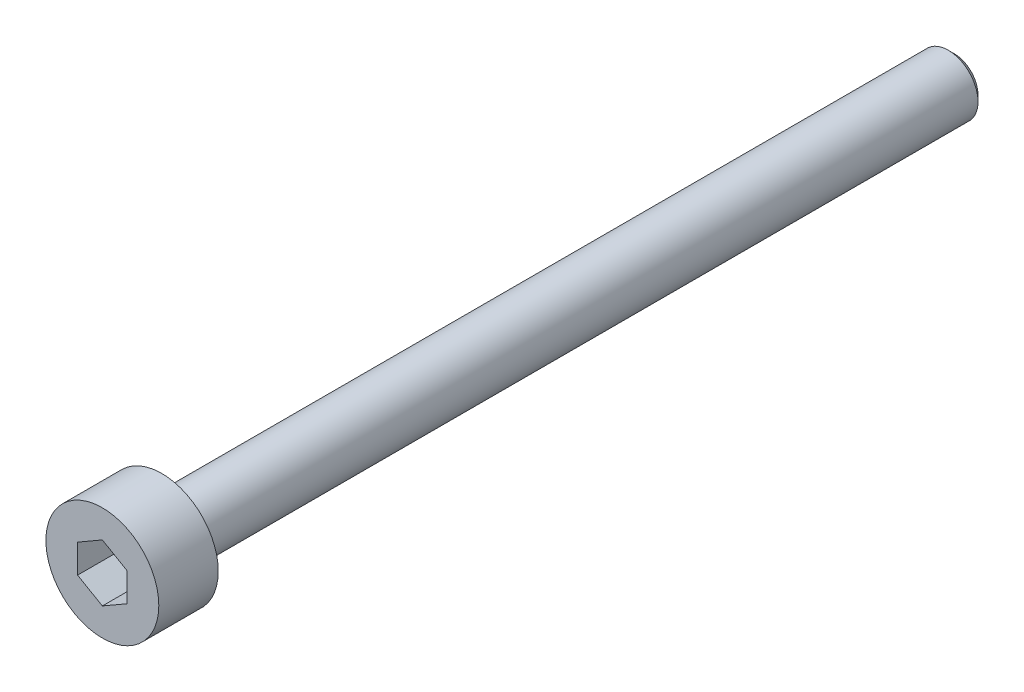
ISO-10303-21;
HEADER;
FILE_DESCRIPTION(('STEP AP214'),'2;1');
FILE_NAME('part.step','',(''),(''),'','','');
FILE_SCHEMA(('AUTOMOTIVE_DESIGN { 1 0 10303 214 1 1 1 1 }'));
ENDSEC;
DATA;
#1=APPLICATION_CONTEXT('core data for automotive mechanical design processes');
#2=APPLICATION_PROTOCOL_DEFINITION('international standard','automotive_design',2000,#1);
#3=PRODUCT_CONTEXT('',#1,'mechanical');
#4=PRODUCT('Part','Part','',(#3));
#5=PRODUCT_RELATED_PRODUCT_CATEGORY('part','',(#4));
#6=PRODUCT_DEFINITION_FORMATION('','',#4);
#7=PRODUCT_DEFINITION_CONTEXT('part definition',#1,'design');
#8=PRODUCT_DEFINITION('design','',#6,#7);
#9=PRODUCT_DEFINITION_SHAPE('','',#8);
#10=(LENGTH_UNIT() NAMED_UNIT(*) SI_UNIT(.MILLI.,.METRE.));
#11=(NAMED_UNIT(*) PLANE_ANGLE_UNIT() SI_UNIT($,.RADIAN.));
#12=(NAMED_UNIT(*) SI_UNIT($,.STERADIAN.) SOLID_ANGLE_UNIT());
#13=UNCERTAINTY_MEASURE_WITH_UNIT(LENGTH_MEASURE(1.E-05),#10,'distance_accuracy_value','');
#14=(GEOMETRIC_REPRESENTATION_CONTEXT(3) GLOBAL_UNCERTAINTY_ASSIGNED_CONTEXT((#13)) GLOBAL_UNIT_ASSIGNED_CONTEXT((#10,
#11,#12)) REPRESENTATION_CONTEXT('',''));
#15=CARTESIAN_POINT('',(0.,0.,0.));
#16=DIRECTION('',(0.,0.,1.));
#17=DIRECTION('',(1.,0.,0.));
#18=AXIS2_PLACEMENT_3D('',#15,#16,#17);
#19=CARTESIAN_POINT('',(0.,0.,0.));
#20=DIRECTION('',(0.,0.,1.));
#21=DIRECTION('',(1.,0.,0.));
#22=AXIS2_PLACEMENT_3D('',#19,#20,#21);
#23=PLANE('',#22);
#24=CARTESIAN_POINT('',(0.,0.,0.));
#25=DIRECTION('',(0.,0.,1.));
#26=DIRECTION('',(1.,0.,0.));
#27=AXIS2_PLACEMENT_3D('',#24,#25,#26);
#28=CIRCLE('',#27,2.85);
#29=CARTESIAN_POINT('',(2.85,0.,0.));
#30=VERTEX_POINT('',#29);
#31=EDGE_CURVE('E140',#30,#30,#28,.T.);
#32=ORIENTED_EDGE('',*,*,#31,.F.);
#33=EDGE_LOOP('',(#32));
#34=FACE_BOUND('',#33,.T.);
#35=CARTESIAN_POINT('',(0.,0.,0.));
#36=DIRECTION('',(0.,0.,1.));
#37=DIRECTION('',(1.,0.,0.));
#38=AXIS2_PLACEMENT_3D('',#35,#36,#37);
#39=CIRCLE('',#38,1.5);
#40=CARTESIAN_POINT('',(1.5,0.,0.));
#41=VERTEX_POINT('',#40);
#42=EDGE_CURVE('E149',#41,#41,#39,.F.);
#43=ORIENTED_EDGE('',*,*,#42,.F.);
#44=EDGE_LOOP('',(#43));
#45=FACE_BOUND('',#44,.T.);
#46=ADVANCED_FACE('F38',(#34,#45),#23,.F.);
#47=CARTESIAN_POINT('',(0.,0.,3.));
#48=DIRECTION('',(0.,0.,-1.));
#49=DIRECTION('',(-1.,0.,0.));
#50=AXIS2_PLACEMENT_3D('',#47,#48,#49);
#51=CYLINDRICAL_SURFACE('',#50,2.85);
#52=CARTESIAN_POINT('',(0.,0.,3.));
#53=DIRECTION('',(0.,0.,1.));
#54=DIRECTION('',(1.,0.,0.));
#55=AXIS2_PLACEMENT_3D('',#52,#53,#54);
#56=CIRCLE('',#55,2.85);
#57=CARTESIAN_POINT('',(2.85,0.,3.));
#58=VERTEX_POINT('',#57);
#59=EDGE_CURVE('E146',#58,#58,#56,.T.);
#60=ORIENTED_EDGE('',*,*,#59,.F.);
#61=EDGE_LOOP('',(#60));
#62=FACE_BOUND('',#61,.T.);
#63=ORIENTED_EDGE('',*,*,#31,.T.);
#64=EDGE_LOOP('',(#63));
#65=FACE_BOUND('',#64,.T.);
#66=ADVANCED_FACE('F171',(#62,#65),#51,.T.);
#67=CARTESIAN_POINT('',(0.,0.,3.));
#68=DIRECTION('',(0.,0.,1.));
#69=DIRECTION('',(1.,0.,0.));
#70=AXIS2_PLACEMENT_3D('',#67,#68,#69);
#71=PLANE('',#70);
#72=DIRECTION('',(-0.866025403784439,0.5,0.));
#73=VECTOR('',#72,1.);
#74=CARTESIAN_POINT('',(1.25,0.721687836487032,3.));
#75=LINE('',#74,#73);
#76=CARTESIAN_POINT('',(1.25,0.721687836487032,3.));
#77=VERTEX_POINT('',#76);
#78=CARTESIAN_POINT('',(0.,1.44337567297406,3.));
#79=VERTEX_POINT('',#78);
#80=EDGE_CURVE('E53',#77,#79,#75,.T.);
#81=ORIENTED_EDGE('',*,*,#80,.F.);
#82=DIRECTION('',(0.,1.,0.));
#83=VECTOR('',#82,1.);
#84=CARTESIAN_POINT('',(1.25,-0.721687836487032,3.));
#85=LINE('',#84,#83);
#86=CARTESIAN_POINT('',(1.25,-0.721687836487032,3.));
#87=VERTEX_POINT('',#86);
#88=EDGE_CURVE('E136',#87,#77,#85,.T.);
#89=ORIENTED_EDGE('',*,*,#88,.F.);
#90=DIRECTION('',(0.866025403784439,0.5,0.));
#91=VECTOR('',#90,1.);
#92=CARTESIAN_POINT('',(0.,-1.44337567297406,3.));
#93=LINE('',#92,#91);
#94=CARTESIAN_POINT('',(0.,-1.44337567297406,3.));
#95=VERTEX_POINT('',#94);
#96=EDGE_CURVE('E134',#95,#87,#93,.T.);
#97=ORIENTED_EDGE('',*,*,#96,.F.);
#98=DIRECTION('',(0.866025403784439,-0.5,0.));
#99=VECTOR('',#98,1.);
#100=CARTESIAN_POINT('',(-1.25,-0.721687836487033,3.));
#101=LINE('',#100,#99);
#102=CARTESIAN_POINT('',(-1.25,-0.721687836487033,3.));
#103=VERTEX_POINT('',#102);
#104=EDGE_CURVE('E101',#103,#95,#101,.T.);
#105=ORIENTED_EDGE('',*,*,#104,.F.);
#106=DIRECTION('',(0.,-1.,0.));
#107=VECTOR('',#106,1.);
#108=CARTESIAN_POINT('',(-1.25,0.721687836487032,3.));
#109=LINE('',#108,#107);
#110=CARTESIAN_POINT('',(-1.25,0.721687836487032,3.));
#111=VERTEX_POINT('',#110);
#112=EDGE_CURVE('E130',#111,#103,#109,.T.);
#113=ORIENTED_EDGE('',*,*,#112,.F.);
#114=DIRECTION('',(-0.866025403784439,-0.5,0.));
#115=VECTOR('',#114,1.);
#116=CARTESIAN_POINT('',(0.,1.44337567297406,3.));
#117=LINE('',#116,#115);
#118=EDGE_CURVE('E127',#79,#111,#117,.T.);
#119=ORIENTED_EDGE('',*,*,#118,.F.);
#120=EDGE_LOOP('',(#81,#89,#97,#105,#113,#119));
#121=FACE_BOUND('',#120,.T.);
#122=ORIENTED_EDGE('',*,*,#59,.T.);
#123=EDGE_LOOP('',(#122));
#124=FACE_BOUND('',#123,.T.);
#125=ADVANCED_FACE('F177',(#121,#124),#71,.T.);
#126=CARTESIAN_POINT('',(0.,0.,-40.));
#127=DIRECTION('',(0.,0.,1.));
#128=DIRECTION('',(1.,0.,0.));
#129=AXIS2_PLACEMENT_3D('',#126,#127,#128);
#130=CYLINDRICAL_SURFACE('',#129,1.5);
#131=CARTESIAN_POINT('',(0.,0.,-39.7));
#132=DIRECTION('',(0.,0.,-1.));
#133=DIRECTION('',(-1.,0.,0.));
#134=AXIS2_PLACEMENT_3D('',#131,#132,#133);
#135=CIRCLE('',#134,1.5);
#136=CARTESIAN_POINT('',(-1.5,0.,-39.7));
#137=VERTEX_POINT('',#136);
#138=EDGE_CURVE('E11',#137,#137,#135,.F.);
#139=ORIENTED_EDGE('',*,*,#138,.T.);
#140=EDGE_LOOP('',(#139));
#141=FACE_BOUND('',#140,.T.);
#142=ORIENTED_EDGE('',*,*,#42,.T.);
#143=EDGE_LOOP('',(#142));
#144=FACE_BOUND('',#143,.T.);
#145=ADVANCED_FACE('F167',(#141,#144),#130,.T.);
#146=CARTESIAN_POINT('',(0.,0.,-40.));
#147=DIRECTION('',(0.,0.,-1.));
#148=DIRECTION('',(-1.,0.,0.));
#149=AXIS2_PLACEMENT_3D('',#146,#147,#148);
#150=PLANE('',#149);
#151=CARTESIAN_POINT('',(0.,0.,-40.));
#152=DIRECTION('',(0.,0.,-1.));
#153=DIRECTION('',(-1.,0.,0.));
#154=AXIS2_PLACEMENT_3D('',#151,#152,#153);
#155=CIRCLE('',#154,1.2);
#156=CARTESIAN_POINT('',(-1.2,0.,-40.));
#157=VERTEX_POINT('',#156);
#158=EDGE_CURVE('E46',#157,#157,#155,.T.);
#159=ORIENTED_EDGE('',*,*,#158,.T.);
#160=EDGE_LOOP('',(#159));
#161=FACE_BOUND('',#160,.T.);
#162=ADVANCED_FACE('F156',(#161),#150,.T.);
#163=CARTESIAN_POINT('',(0.,0.,-40.));
#164=DIRECTION('',(0.,0.,1.));
#165=DIRECTION('',(1.,0.,0.));
#166=AXIS2_PLACEMENT_3D('',#163,#164,#165);
#167=CONICAL_SURFACE('',#166,1.2,0.785398163397423);
#168=ORIENTED_EDGE('',*,*,#138,.F.);
#169=EDGE_LOOP('',(#168));
#170=FACE_BOUND('',#169,.T.);
#171=ORIENTED_EDGE('',*,*,#158,.F.);
#172=EDGE_LOOP('',(#171));
#173=FACE_BOUND('',#172,.T.);
#174=ADVANCED_FACE('F40',(#170,#173),#167,.T.);
#175=CARTESIAN_POINT('',(1.25,0.721687836487032,1.));
#176=DIRECTION('',(0.5,0.866025403784439,0.));
#177=DIRECTION('',(-0.866025403784439,0.5,0.));
#178=AXIS2_PLACEMENT_3D('',#175,#176,#177);
#179=PLANE('',#178);
#180=ORIENTED_EDGE('',*,*,#80,.T.);
#181=DIRECTION('',(0.,0.,1.));
#182=VECTOR('',#181,1.);
#183=CARTESIAN_POINT('',(0.,1.44337567297406,1.));
#184=LINE('',#183,#182);
#185=CARTESIAN_POINT('',(0.,1.44337567297406,1.));
#186=VERTEX_POINT('',#185);
#187=EDGE_CURVE('E83',#186,#79,#184,.T.);
#188=ORIENTED_EDGE('',*,*,#187,.F.);
#189=DIRECTION('',(-0.866025403784439,0.5,0.));
#190=VECTOR('',#189,1.);
#191=CARTESIAN_POINT('',(1.25,0.721687836487032,1.));
#192=LINE('',#191,#190);
#193=CARTESIAN_POINT('',(1.25,0.721687836487032,1.));
#194=VERTEX_POINT('',#193);
#195=EDGE_CURVE('E138',#194,#186,#192,.T.);
#196=ORIENTED_EDGE('',*,*,#195,.F.);
#197=DIRECTION('',(0.,0.,1.));
#198=VECTOR('',#197,1.);
#199=CARTESIAN_POINT('',(1.25,0.721687836487032,1.));
#200=LINE('',#199,#198);
#201=EDGE_CURVE('E61',#194,#77,#200,.T.);
#202=ORIENTED_EDGE('',*,*,#201,.T.);
#203=EDGE_LOOP('',(#180,#188,#196,#202));
#204=FACE_BOUND('',#203,.T.);
#205=ADVANCED_FACE('F159',(#204),#179,.F.);
#206=CARTESIAN_POINT('',(1.25,-0.721687836487032,1.));
#207=DIRECTION('',(1.,0.,0.));
#208=DIRECTION('',(0.,1.,0.));
#209=AXIS2_PLACEMENT_3D('',#206,#207,#208);
#210=PLANE('',#209);
#211=ORIENTED_EDGE('',*,*,#88,.T.);
#212=ORIENTED_EDGE('',*,*,#201,.F.);
#213=DIRECTION('',(0.,1.,0.));
#214=VECTOR('',#213,1.);
#215=CARTESIAN_POINT('',(1.25,-0.721687836487032,1.));
#216=LINE('',#215,#214);
#217=CARTESIAN_POINT('',(1.25,-0.721687836487032,1.));
#218=VERTEX_POINT('',#217);
#219=EDGE_CURVE('E113',#218,#194,#216,.T.);
#220=ORIENTED_EDGE('',*,*,#219,.F.);
#221=DIRECTION('',(0.,0.,1.));
#222=VECTOR('',#221,1.);
#223=CARTESIAN_POINT('',(1.25,-0.721687836487032,1.));
#224=LINE('',#223,#222);
#225=EDGE_CURVE('E105',#218,#87,#224,.T.);
#226=ORIENTED_EDGE('',*,*,#225,.T.);
#227=EDGE_LOOP('',(#211,#212,#220,#226));
#228=FACE_BOUND('',#227,.T.);
#229=ADVANCED_FACE('F165',(#228),#210,.F.);
#230=CARTESIAN_POINT('',(0.,-1.44337567297406,1.));
#231=DIRECTION('',(0.5,-0.866025403784439,0.));
#232=DIRECTION('',(0.866025403784439,0.5,0.));
#233=AXIS2_PLACEMENT_3D('',#230,#231,#232);
#234=PLANE('',#233);
#235=ORIENTED_EDGE('',*,*,#96,.T.);
#236=ORIENTED_EDGE('',*,*,#225,.F.);
#237=DIRECTION('',(0.866025403784439,0.5,0.));
#238=VECTOR('',#237,1.);
#239=CARTESIAN_POINT('',(0.,-1.44337567297406,1.));
#240=LINE('',#239,#238);
#241=CARTESIAN_POINT('',(0.,-1.44337567297406,1.));
#242=VERTEX_POINT('',#241);
#243=EDGE_CURVE('E109',#242,#218,#240,.T.);
#244=ORIENTED_EDGE('',*,*,#243,.F.);
#245=DIRECTION('',(0.,0.,1.));
#246=VECTOR('',#245,1.);
#247=CARTESIAN_POINT('',(0.,-1.44337567297406,1.));
#248=LINE('',#247,#246);
#249=EDGE_CURVE('E94',#242,#95,#248,.T.);
#250=ORIENTED_EDGE('',*,*,#249,.T.);
#251=EDGE_LOOP('',(#235,#236,#244,#250));
#252=FACE_BOUND('',#251,.T.);
#253=ADVANCED_FACE('F110',(#252),#234,.F.);
#254=CARTESIAN_POINT('',(-1.25,-0.721687836487033,1.));
#255=DIRECTION('',(-0.5,-0.866025403784439,0.));
#256=DIRECTION('',(0.866025403784439,-0.5,0.));
#257=AXIS2_PLACEMENT_3D('',#254,#255,#256);
#258=PLANE('',#257);
#259=ORIENTED_EDGE('',*,*,#104,.T.);
#260=ORIENTED_EDGE('',*,*,#249,.F.);
#261=DIRECTION('',(0.866025403784439,-0.5,0.));
#262=VECTOR('',#261,1.);
#263=CARTESIAN_POINT('',(-1.25,-0.721687836487033,1.));
#264=LINE('',#263,#262);
#265=CARTESIAN_POINT('',(-1.25,-0.721687836487033,1.));
#266=VERTEX_POINT('',#265);
#267=EDGE_CURVE('E98',#266,#242,#264,.T.);
#268=ORIENTED_EDGE('',*,*,#267,.F.);
#269=DIRECTION('',(0.,0.,1.));
#270=VECTOR('',#269,1.);
#271=CARTESIAN_POINT('',(-1.25,-0.721687836487033,1.));
#272=LINE('',#271,#270);
#273=EDGE_CURVE('E106',#266,#103,#272,.T.);
#274=ORIENTED_EDGE('',*,*,#273,.T.);
#275=EDGE_LOOP('',(#259,#260,#268,#274));
#276=FACE_BOUND('',#275,.T.);
#277=ADVANCED_FACE('F96',(#276),#258,.F.);
#278=CARTESIAN_POINT('',(-1.25,0.721687836487032,1.));
#279=DIRECTION('',(-1.,0.,0.));
#280=DIRECTION('',(0.,0.,1.));
#281=AXIS2_PLACEMENT_3D('',#278,#279,#280);
#282=PLANE('',#281);
#283=ORIENTED_EDGE('',*,*,#112,.T.);
#284=ORIENTED_EDGE('',*,*,#273,.F.);
#285=DIRECTION('',(0.,-1.,0.));
#286=VECTOR('',#285,1.);
#287=CARTESIAN_POINT('',(-1.25,0.721687836487032,1.));
#288=LINE('',#287,#286);
#289=CARTESIAN_POINT('',(-1.25,0.721687836487032,1.));
#290=VERTEX_POINT('',#289);
#291=EDGE_CURVE('E119',#290,#266,#288,.T.);
#292=ORIENTED_EDGE('',*,*,#291,.F.);
#293=DIRECTION('',(0.,0.,1.));
#294=VECTOR('',#293,1.);
#295=CARTESIAN_POINT('',(-1.25,0.721687836487032,1.));
#296=LINE('',#295,#294);
#297=EDGE_CURVE('E143',#290,#111,#296,.T.);
#298=ORIENTED_EDGE('',*,*,#297,.T.);
#299=EDGE_LOOP('',(#283,#284,#292,#298));
#300=FACE_BOUND('',#299,.T.);
#301=ADVANCED_FACE('F191',(#300),#282,.F.);
#302=CARTESIAN_POINT('',(0.,1.44337567297406,1.));
#303=DIRECTION('',(-0.5,0.866025403784439,0.));
#304=DIRECTION('',(-0.866025403784439,-0.5,0.));
#305=AXIS2_PLACEMENT_3D('',#302,#303,#304);
#306=PLANE('',#305);
#307=ORIENTED_EDGE('',*,*,#118,.T.);
#308=ORIENTED_EDGE('',*,*,#297,.F.);
#309=DIRECTION('',(-0.866025403784439,-0.5,0.));
#310=VECTOR('',#309,1.);
#311=CARTESIAN_POINT('',(0.,1.44337567297406,1.));
#312=LINE('',#311,#310);
#313=EDGE_CURVE('E121',#186,#290,#312,.T.);
#314=ORIENTED_EDGE('',*,*,#313,.F.);
#315=ORIENTED_EDGE('',*,*,#187,.T.);
#316=EDGE_LOOP('',(#307,#308,#314,#315));
#317=FACE_BOUND('',#316,.T.);
#318=ADVANCED_FACE('F188',(#317),#306,.F.);
#319=CARTESIAN_POINT('',(0.,0.,1.));
#320=DIRECTION('',(0.,0.,1.));
#321=DIRECTION('',(1.,0.,0.));
#322=AXIS2_PLACEMENT_3D('',#319,#320,#321);
#323=PLANE('',#322);
#324=ORIENTED_EDGE('',*,*,#195,.T.);
#325=ORIENTED_EDGE('',*,*,#313,.T.);
#326=ORIENTED_EDGE('',*,*,#291,.T.);
#327=ORIENTED_EDGE('',*,*,#267,.T.);
#328=ORIENTED_EDGE('',*,*,#243,.T.);
#329=ORIENTED_EDGE('',*,*,#219,.T.);
#330=EDGE_LOOP('',(#324,#325,#326,#327,#328,#329));
#331=FACE_BOUND('',#330,.T.);
#332=ADVANCED_FACE('F116',(#331),#323,.T.);
#333=CLOSED_SHELL('',(#46,#66,#125,#145,#162,#174,#205,#229,#253,#277,#301,#318,#332));
#334=MANIFOLD_SOLID_BREP('B2',#333);
#335=ADVANCED_BREP_SHAPE_REPRESENTATION('',(#18,#334),#14);
#336=SHAPE_DEFINITION_REPRESENTATION(#9,#335);
ENDSEC;
END-ISO-10303-21;
